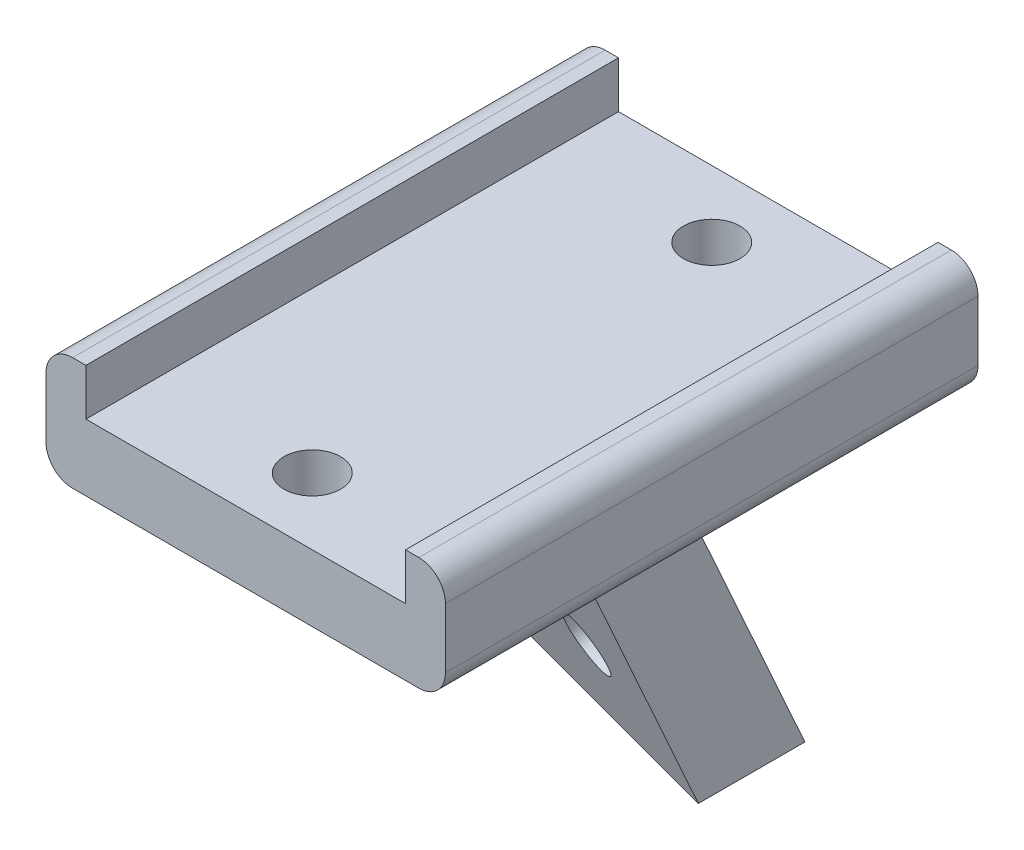
ISO-10303-21;
HEADER;
FILE_DESCRIPTION(('STEP AP214'),'2;1');
FILE_NAME('part.step','',(''),(''),'','','');
FILE_SCHEMA(('AUTOMOTIVE_DESIGN { 1 0 10303 214 1 1 1 1 }'));
ENDSEC;
DATA;
#1=APPLICATION_CONTEXT('core data for automotive mechanical design processes');
#2=APPLICATION_PROTOCOL_DEFINITION('international standard','automotive_design',2000,#1);
#3=PRODUCT_CONTEXT('',#1,'mechanical');
#4=PRODUCT('Part','Part','',(#3));
#5=PRODUCT_RELATED_PRODUCT_CATEGORY('part','',(#4));
#6=PRODUCT_DEFINITION_FORMATION('','',#4);
#7=PRODUCT_DEFINITION_CONTEXT('part definition',#1,'design');
#8=PRODUCT_DEFINITION('design','',#6,#7);
#9=PRODUCT_DEFINITION_SHAPE('','',#8);
#10=(LENGTH_UNIT() NAMED_UNIT(*) SI_UNIT(.MILLI.,.METRE.));
#11=(NAMED_UNIT(*) PLANE_ANGLE_UNIT() SI_UNIT($,.RADIAN.));
#12=(NAMED_UNIT(*) SI_UNIT($,.STERADIAN.) SOLID_ANGLE_UNIT());
#13=UNCERTAINTY_MEASURE_WITH_UNIT(LENGTH_MEASURE(1.E-05),#10,'distance_accuracy_value','');
#14=(GEOMETRIC_REPRESENTATION_CONTEXT(3) GLOBAL_UNCERTAINTY_ASSIGNED_CONTEXT((#13)) GLOBAL_UNIT_ASSIGNED_CONTEXT((#10,
#11,#12)) REPRESENTATION_CONTEXT('',''));
#15=CARTESIAN_POINT('',(0.,0.,0.));
#16=DIRECTION('',(0.,0.,1.));
#17=DIRECTION('',(1.,0.,0.));
#18=AXIS2_PLACEMENT_3D('',#15,#16,#17);
#19=CARTESIAN_POINT('',(0.,0.,0.));
#20=DIRECTION('',(0.,-1.,0.));
#21=DIRECTION('',(0.,0.,-1.));
#22=AXIS2_PLACEMENT_3D('',#19,#20,#21);
#23=PLANE('',#22);
#24=CARTESIAN_POINT('',(0.,0.,-15.));
#25=DIRECTION('',(0.,1.,0.));
#26=DIRECTION('',(0.,0.,1.));
#27=AXIS2_PLACEMENT_3D('',#24,#25,#26);
#28=CIRCLE('',#27,2.125);
#29=CARTESIAN_POINT('',(0.,0.,-12.875));
#30=VERTEX_POINT('',#29);
#31=EDGE_CURVE('E434',#30,#30,#28,.T.);
#32=ORIENTED_EDGE('',*,*,#31,.T.);
#33=EDGE_LOOP('',(#32));
#34=FACE_BOUND('',#33,.T.);
#35=DIRECTION('',(-1.,0.,0.));
#36=VECTOR('',#35,1.);
#37=CARTESIAN_POINT('',(-11.,0.,-20.));
#38=LINE('',#37,#36);
#39=CARTESIAN_POINT('',(13.,0.,-20.));
#40=VERTEX_POINT('',#39);
#41=CARTESIAN_POINT('',(-13.,0.,-20.));
#42=VERTEX_POINT('',#41);
#43=EDGE_CURVE('E440',#40,#42,#38,.T.);
#44=ORIENTED_EDGE('',*,*,#43,.F.);
#45=DIRECTION('',(0.,0.,-1.));
#46=VECTOR('',#45,1.);
#47=CARTESIAN_POINT('',(13.,0.,0.));
#48=LINE('',#47,#46);
#49=CARTESIAN_POINT('',(13.,0.,20.));
#50=VERTEX_POINT('',#49);
#51=EDGE_CURVE('E373',#40,#50,#48,.F.);
#52=ORIENTED_EDGE('',*,*,#51,.T.);
#53=DIRECTION('',(1.,0.,0.));
#54=VECTOR('',#53,1.);
#55=CARTESIAN_POINT('',(-11.,0.,20.));
#56=LINE('',#55,#54);
#57=CARTESIAN_POINT('',(-13.,0.,20.));
#58=VERTEX_POINT('',#57);
#59=EDGE_CURVE('E445',#58,#50,#56,.T.);
#60=ORIENTED_EDGE('',*,*,#59,.F.);
#61=DIRECTION('',(0.,0.,-1.));
#62=VECTOR('',#61,1.);
#63=CARTESIAN_POINT('',(-13.,0.,0.));
#64=LINE('',#63,#62);
#65=EDGE_CURVE('E463',#58,#42,#64,.T.);
#66=ORIENTED_EDGE('',*,*,#65,.T.);
#67=EDGE_LOOP('',(#44,#52,#60,#66));
#68=FACE_BOUND('',#67,.T.);
#69=CARTESIAN_POINT('',(0.,0.,15.));
#70=DIRECTION('',(0.,1.,0.));
#71=DIRECTION('',(0.,0.,1.));
#72=AXIS2_PLACEMENT_3D('',#69,#70,#71);
#73=CIRCLE('',#72,2.125);
#74=CARTESIAN_POINT('',(0.,0.,17.125));
#75=VERTEX_POINT('',#74);
#76=EDGE_CURVE('E418',#75,#75,#73,.T.);
#77=ORIENTED_EDGE('',*,*,#76,.T.);
#78=EDGE_LOOP('',(#77));
#79=FACE_BOUND('',#78,.T.);
#80=DIRECTION('',(0.965925826289067,0.,0.258819045102525));
#81=VECTOR('',#80,1.);
#82=CARTESIAN_POINT('',(11.,0.,-2.));
#83=LINE('',#82,#81);
#84=CARTESIAN_POINT('',(-11.,0.,-7.89488223348481));
#85=VERTEX_POINT('',#84);
#86=CARTESIAN_POINT('',(11.,0.,-2.));
#87=VERTEX_POINT('',#86);
#88=EDGE_CURVE('E179',#85,#87,#83,.T.);
#89=ORIENTED_EDGE('',*,*,#88,.F.);
#90=DIRECTION('',(0.,0.,-1.));
#91=VECTOR('',#90,1.);
#92=CARTESIAN_POINT('',(-11.,0.,-7.89488223348481));
#93=LINE('',#92,#91);
#94=CARTESIAN_POINT('',(-11.,0.,0.105117766515197));
#95=VERTEX_POINT('',#94);
#96=EDGE_CURVE('E186',#95,#85,#93,.T.);
#97=ORIENTED_EDGE('',*,*,#96,.F.);
#98=DIRECTION('',(-0.965925826289067,0.,-0.258819045102525));
#99=VECTOR('',#98,1.);
#100=CARTESIAN_POINT('',(-11.,0.,0.105117766515197));
#101=LINE('',#100,#99);
#102=CARTESIAN_POINT('',(11.,0.,6.));
#103=VERTEX_POINT('',#102);
#104=EDGE_CURVE('E184',#103,#95,#101,.T.);
#105=ORIENTED_EDGE('',*,*,#104,.F.);
#106=DIRECTION('',(0.,0.,1.));
#107=VECTOR('',#106,1.);
#108=CARTESIAN_POINT('',(11.,0.,6.));
#109=LINE('',#108,#107);
#110=EDGE_CURVE('E171',#87,#103,#109,.T.);
#111=ORIENTED_EDGE('',*,*,#110,.F.);
#112=EDGE_LOOP('',(#89,#97,#105,#111));
#113=FACE_BOUND('',#112,.T.);
#114=ADVANCED_FACE('F48',(#34,#68,#79,#113),#23,.T.);
#115=CARTESIAN_POINT('',(0.,5.,0.));
#116=DIRECTION('',(0.,-1.,0.));
#117=DIRECTION('',(0.,0.,-1.));
#118=AXIS2_PLACEMENT_3D('',#115,#116,#117);
#119=PLANE('',#118);
#120=DIRECTION('',(1.,0.,0.));
#121=VECTOR('',#120,1.);
#122=CARTESIAN_POINT('',(-11.,5.,20.));
#123=LINE('',#122,#121);
#124=CARTESIAN_POINT('',(-12.,5.,20.));
#125=VERTEX_POINT('',#124);
#126=CARTESIAN_POINT('',(12.,5.,20.));
#127=VERTEX_POINT('',#126);
#128=EDGE_CURVE('E444',#125,#127,#123,.T.);
#129=ORIENTED_EDGE('',*,*,#128,.T.);
#130=DIRECTION('',(0.,0.,-1.));
#131=VECTOR('',#130,1.);
#132=CARTESIAN_POINT('',(12.,5.,29.394147114028));
#133=LINE('',#132,#131);
#134=CARTESIAN_POINT('',(12.,5.,-20.));
#135=VERTEX_POINT('',#134);
#136=EDGE_CURVE('E427',#127,#135,#133,.T.);
#137=ORIENTED_EDGE('',*,*,#136,.T.);
#138=DIRECTION('',(-1.,0.,0.));
#139=VECTOR('',#138,1.);
#140=CARTESIAN_POINT('',(-11.,5.,-20.));
#141=LINE('',#140,#139);
#142=CARTESIAN_POINT('',(-12.,5.,-20.));
#143=VERTEX_POINT('',#142);
#144=EDGE_CURVE('E442',#135,#143,#141,.T.);
#145=ORIENTED_EDGE('',*,*,#144,.T.);
#146=DIRECTION('',(0.,0.,-1.));
#147=VECTOR('',#146,1.);
#148=CARTESIAN_POINT('',(-12.,5.,29.394147114028));
#149=LINE('',#148,#147);
#150=EDGE_CURVE('E390',#125,#143,#149,.T.);
#151=ORIENTED_EDGE('',*,*,#150,.F.);
#152=EDGE_LOOP('',(#129,#137,#145,#151));
#153=FACE_BOUND('',#152,.T.);
#154=CARTESIAN_POINT('',(0.,5.,-15.));
#155=DIRECTION('',(0.,1.,0.));
#156=DIRECTION('',(0.,0.,1.));
#157=AXIS2_PLACEMENT_3D('',#154,#155,#156);
#158=CIRCLE('',#157,2.125);
#159=CARTESIAN_POINT('',(0.,5.,-12.875));
#160=VERTEX_POINT('',#159);
#161=EDGE_CURVE('E437',#160,#160,#158,.T.);
#162=ORIENTED_EDGE('',*,*,#161,.F.);
#163=EDGE_LOOP('',(#162));
#164=FACE_BOUND('',#163,.T.);
#165=CARTESIAN_POINT('',(0.,5.,15.));
#166=DIRECTION('',(0.,1.,0.));
#167=DIRECTION('',(0.,0.,1.));
#168=AXIS2_PLACEMENT_3D('',#165,#166,#167);
#169=CIRCLE('',#168,2.125);
#170=CARTESIAN_POINT('',(0.,5.,17.125));
#171=VERTEX_POINT('',#170);
#172=EDGE_CURVE('E431',#171,#171,#169,.T.);
#173=ORIENTED_EDGE('',*,*,#172,.F.);
#174=EDGE_LOOP('',(#173));
#175=FACE_BOUND('',#174,.T.);
#176=ADVANCED_FACE('F325',(#153,#164,#175),#119,.F.);
#177=CARTESIAN_POINT('',(-11.,5.,-20.));
#178=DIRECTION('',(0.,0.,1.));
#179=DIRECTION('',(1.,0.,0.));
#180=AXIS2_PLACEMENT_3D('',#177,#178,#179);
#181=PLANE('',#180);
#182=DIRECTION('',(0.,-1.,0.));
#183=VECTOR('',#182,1.);
#184=CARTESIAN_POINT('',(15.,8.5,-20.));
#185=LINE('',#184,#183);
#186=CARTESIAN_POINT('',(15.,6.5,-20.));
#187=VERTEX_POINT('',#186);
#188=CARTESIAN_POINT('',(15.,2.,-20.));
#189=VERTEX_POINT('',#188);
#190=EDGE_CURVE('E424',#187,#189,#185,.T.);
#191=ORIENTED_EDGE('',*,*,#190,.T.);
#192=CARTESIAN_POINT('',(13.,2.,-20.));
#193=DIRECTION('',(0.,0.,1.));
#194=DIRECTION('',(1.,0.,0.));
#195=AXIS2_PLACEMENT_3D('',#192,#193,#194);
#196=CIRCLE('',#195,2.);
#197=EDGE_CURVE('E461',#189,#40,#196,.F.);
#198=ORIENTED_EDGE('',*,*,#197,.T.);
#199=ORIENTED_EDGE('',*,*,#43,.T.);
#200=CARTESIAN_POINT('',(-13.,2.,-20.));
#201=DIRECTION('',(0.,0.,1.));
#202=DIRECTION('',(1.,0.,0.));
#203=AXIS2_PLACEMENT_3D('',#200,#201,#202);
#204=CIRCLE('',#203,2.);
#205=CARTESIAN_POINT('',(-15.,2.,-20.));
#206=VERTEX_POINT('',#205);
#207=EDGE_CURVE('E459',#42,#206,#204,.F.);
#208=ORIENTED_EDGE('',*,*,#207,.T.);
#209=DIRECTION('',(0.,1.,0.));
#210=VECTOR('',#209,1.);
#211=CARTESIAN_POINT('',(-15.,8.5,-20.));
#212=LINE('',#211,#210);
#213=CARTESIAN_POINT('',(-15.,6.5,-20.));
#214=VERTEX_POINT('',#213);
#215=EDGE_CURVE('E286',#206,#214,#212,.T.);
#216=ORIENTED_EDGE('',*,*,#215,.T.);
#217=CARTESIAN_POINT('',(-13.,6.5,-20.));
#218=DIRECTION('',(0.,0.,1.));
#219=DIRECTION('',(1.,0.,0.));
#220=AXIS2_PLACEMENT_3D('',#217,#218,#219);
#221=CIRCLE('',#220,2.);
#222=CARTESIAN_POINT('',(-13.,8.5,-20.));
#223=VERTEX_POINT('',#222);
#224=EDGE_CURVE('E457',#214,#223,#221,.F.);
#225=ORIENTED_EDGE('',*,*,#224,.T.);
#226=DIRECTION('',(1.,0.,0.));
#227=VECTOR('',#226,1.);
#228=CARTESIAN_POINT('',(-12.,8.5,-20.));
#229=LINE('',#228,#227);
#230=CARTESIAN_POINT('',(-12.,8.5,-20.));
#231=VERTEX_POINT('',#230);
#232=EDGE_CURVE('E386',#223,#231,#229,.T.);
#233=ORIENTED_EDGE('',*,*,#232,.T.);
#234=DIRECTION('',(0.,-1.,0.));
#235=VECTOR('',#234,1.);
#236=CARTESIAN_POINT('',(-12.,5.,-20.));
#237=LINE('',#236,#235);
#238=EDGE_CURVE('E403',#231,#143,#237,.T.);
#239=ORIENTED_EDGE('',*,*,#238,.T.);
#240=ORIENTED_EDGE('',*,*,#144,.F.);
#241=DIRECTION('',(0.,1.,0.));
#242=VECTOR('',#241,1.);
#243=CARTESIAN_POINT('',(12.,5.,-20.));
#244=LINE('',#243,#242);
#245=CARTESIAN_POINT('',(12.,8.5,-20.));
#246=VERTEX_POINT('',#245);
#247=EDGE_CURVE('E408',#135,#246,#244,.T.);
#248=ORIENTED_EDGE('',*,*,#247,.T.);
#249=DIRECTION('',(1.,0.,0.));
#250=VECTOR('',#249,1.);
#251=CARTESIAN_POINT('',(12.,8.5,-20.));
#252=LINE('',#251,#250);
#253=CARTESIAN_POINT('',(13.,8.5,-20.));
#254=VERTEX_POINT('',#253);
#255=EDGE_CURVE('E421',#246,#254,#252,.T.);
#256=ORIENTED_EDGE('',*,*,#255,.T.);
#257=CARTESIAN_POINT('',(13.,6.5,-20.));
#258=DIRECTION('',(0.,0.,1.));
#259=DIRECTION('',(1.,0.,0.));
#260=AXIS2_PLACEMENT_3D('',#257,#258,#259);
#261=CIRCLE('',#260,2.);
#262=EDGE_CURVE('E455',#254,#187,#261,.F.);
#263=ORIENTED_EDGE('',*,*,#262,.T.);
#264=EDGE_LOOP('',(#191,#198,#199,#208,#216,#225,#233,#239,#240,#248,#256,#263));
#265=FACE_BOUND('',#264,.T.);
#266=ADVANCED_FACE('F331',(#265),#181,.F.);
#267=CARTESIAN_POINT('',(-11.,5.,20.));
#268=DIRECTION('',(0.,0.,-1.));
#269=DIRECTION('',(-1.,0.,0.));
#270=AXIS2_PLACEMENT_3D('',#267,#268,#269);
#271=PLANE('',#270);
#272=ORIENTED_EDGE('',*,*,#59,.T.);
#273=CARTESIAN_POINT('',(13.,2.,20.));
#274=DIRECTION('',(0.,0.,-1.));
#275=DIRECTION('',(-1.,0.,0.));
#276=AXIS2_PLACEMENT_3D('',#273,#274,#275);
#277=CIRCLE('',#276,2.);
#278=CARTESIAN_POINT('',(15.,2.,20.));
#279=VERTEX_POINT('',#278);
#280=EDGE_CURVE('E371',#50,#279,#277,.F.);
#281=ORIENTED_EDGE('',*,*,#280,.T.);
#282=DIRECTION('',(0.,1.,0.));
#283=VECTOR('',#282,1.);
#284=CARTESIAN_POINT('',(15.,8.5,20.));
#285=LINE('',#284,#283);
#286=CARTESIAN_POINT('',(15.,6.5,20.));
#287=VERTEX_POINT('',#286);
#288=EDGE_CURVE('E415',#279,#287,#285,.T.);
#289=ORIENTED_EDGE('',*,*,#288,.T.);
#290=CARTESIAN_POINT('',(13.,6.5,20.));
#291=DIRECTION('',(0.,0.,-1.));
#292=DIRECTION('',(-1.,0.,0.));
#293=AXIS2_PLACEMENT_3D('',#290,#291,#292);
#294=CIRCLE('',#293,2.);
#295=CARTESIAN_POINT('',(13.,8.5,20.));
#296=VERTEX_POINT('',#295);
#297=EDGE_CURVE('E369',#287,#296,#294,.F.);
#298=ORIENTED_EDGE('',*,*,#297,.T.);
#299=DIRECTION('',(-1.,0.,0.));
#300=VECTOR('',#299,1.);
#301=CARTESIAN_POINT('',(12.,8.5,20.));
#302=LINE('',#301,#300);
#303=CARTESIAN_POINT('',(12.,8.5,20.));
#304=VERTEX_POINT('',#303);
#305=EDGE_CURVE('E412',#296,#304,#302,.T.);
#306=ORIENTED_EDGE('',*,*,#305,.T.);
#307=DIRECTION('',(0.,-1.,0.));
#308=VECTOR('',#307,1.);
#309=CARTESIAN_POINT('',(12.,5.,20.));
#310=LINE('',#309,#308);
#311=EDGE_CURVE('E409',#304,#127,#310,.T.);
#312=ORIENTED_EDGE('',*,*,#311,.T.);
#313=ORIENTED_EDGE('',*,*,#128,.F.);
#314=DIRECTION('',(0.,1.,0.));
#315=VECTOR('',#314,1.);
#316=CARTESIAN_POINT('',(-12.,5.,20.));
#317=LINE('',#316,#315);
#318=CARTESIAN_POINT('',(-12.,8.5,20.));
#319=VERTEX_POINT('',#318);
#320=EDGE_CURVE('E389',#125,#319,#317,.T.);
#321=ORIENTED_EDGE('',*,*,#320,.T.);
#322=DIRECTION('',(-1.,0.,0.));
#323=VECTOR('',#322,1.);
#324=CARTESIAN_POINT('',(-12.,8.5,20.));
#325=LINE('',#324,#323);
#326=CARTESIAN_POINT('',(-13.,8.5,20.));
#327=VERTEX_POINT('',#326);
#328=EDGE_CURVE('E384',#319,#327,#325,.T.);
#329=ORIENTED_EDGE('',*,*,#328,.T.);
#330=CARTESIAN_POINT('',(-13.,6.5,20.));
#331=DIRECTION('',(0.,0.,-1.));
#332=DIRECTION('',(-1.,0.,0.));
#333=AXIS2_PLACEMENT_3D('',#330,#331,#332);
#334=CIRCLE('',#333,2.);
#335=CARTESIAN_POINT('',(-15.,6.5,20.));
#336=VERTEX_POINT('',#335);
#337=EDGE_CURVE('E364',#327,#336,#334,.F.);
#338=ORIENTED_EDGE('',*,*,#337,.T.);
#339=DIRECTION('',(0.,-1.,0.));
#340=VECTOR('',#339,1.);
#341=CARTESIAN_POINT('',(-15.,8.5,20.));
#342=LINE('',#341,#340);
#343=CARTESIAN_POINT('',(-15.,2.,20.));
#344=VERTEX_POINT('',#343);
#345=EDGE_CURVE('E392',#336,#344,#342,.T.);
#346=ORIENTED_EDGE('',*,*,#345,.T.);
#347=CARTESIAN_POINT('',(-13.,2.,20.));
#348=DIRECTION('',(0.,0.,-1.));
#349=DIRECTION('',(-1.,0.,0.));
#350=AXIS2_PLACEMENT_3D('',#347,#348,#349);
#351=CIRCLE('',#350,2.);
#352=EDGE_CURVE('E368',#344,#58,#351,.F.);
#353=ORIENTED_EDGE('',*,*,#352,.T.);
#354=EDGE_LOOP('',(#272,#281,#289,#298,#306,#312,#313,#321,#329,#338,#346,#353));
#355=FACE_BOUND('',#354,.T.);
#356=ADVANCED_FACE('F338',(#355),#271,.F.);
#357=CARTESIAN_POINT('',(0.,5.,-15.));
#358=DIRECTION('',(0.,-1.,0.));
#359=DIRECTION('',(0.,0.,-1.));
#360=AXIS2_PLACEMENT_3D('',#357,#358,#359);
#361=CYLINDRICAL_SURFACE('',#360,2.125);
#362=ORIENTED_EDGE('',*,*,#161,.T.);
#363=EDGE_LOOP('',(#362));
#364=FACE_BOUND('',#363,.T.);
#365=ORIENTED_EDGE('',*,*,#31,.F.);
#366=EDGE_LOOP('',(#365));
#367=FACE_BOUND('',#366,.T.);
#368=ADVANCED_FACE('F341',(#364,#367),#361,.F.);
#369=CARTESIAN_POINT('',(0.,5.,15.));
#370=DIRECTION('',(0.,-1.,0.));
#371=DIRECTION('',(0.,0.,-1.));
#372=AXIS2_PLACEMENT_3D('',#369,#370,#371);
#373=CYLINDRICAL_SURFACE('',#372,2.125);
#374=ORIENTED_EDGE('',*,*,#172,.T.);
#375=EDGE_LOOP('',(#374));
#376=FACE_BOUND('',#375,.T.);
#377=ORIENTED_EDGE('',*,*,#76,.F.);
#378=EDGE_LOOP('',(#377));
#379=FACE_BOUND('',#378,.T.);
#380=ADVANCED_FACE('F502',(#376,#379),#373,.F.);
#381=CARTESIAN_POINT('',(15.,8.5,29.394147114028));
#382=DIRECTION('',(1.,0.,0.));
#383=DIRECTION('',(0.,1.,0.));
#384=AXIS2_PLACEMENT_3D('',#381,#382,#383);
#385=PLANE('',#384);
#386=ORIENTED_EDGE('',*,*,#288,.F.);
#387=DIRECTION('',(0.,0.,-1.));
#388=VECTOR('',#387,1.);
#389=CARTESIAN_POINT('',(15.,2.,29.394147114028));
#390=LINE('',#389,#388);
#391=EDGE_CURVE('E452',#279,#189,#390,.T.);
#392=ORIENTED_EDGE('',*,*,#391,.T.);
#393=ORIENTED_EDGE('',*,*,#190,.F.);
#394=DIRECTION('',(0.,0.,-1.));
#395=VECTOR('',#394,1.);
#396=CARTESIAN_POINT('',(15.,6.5,29.394147114028));
#397=LINE('',#396,#395);
#398=EDGE_CURVE('E447',#187,#287,#397,.F.);
#399=ORIENTED_EDGE('',*,*,#398,.T.);
#400=EDGE_LOOP('',(#386,#392,#393,#399));
#401=FACE_BOUND('',#400,.T.);
#402=ADVANCED_FACE('F476',(#401),#385,.T.);
#403=CARTESIAN_POINT('',(12.,8.5,29.394147114028));
#404=DIRECTION('',(0.,1.,0.));
#405=DIRECTION('',(0.,0.,1.));
#406=AXIS2_PLACEMENT_3D('',#403,#404,#405);
#407=PLANE('',#406);
#408=ORIENTED_EDGE('',*,*,#305,.F.);
#409=DIRECTION('',(0.,0.,-1.));
#410=VECTOR('',#409,1.);
#411=CARTESIAN_POINT('',(13.,8.5,29.394147114028));
#412=LINE('',#411,#410);
#413=EDGE_CURVE('E12',#296,#254,#412,.T.);
#414=ORIENTED_EDGE('',*,*,#413,.T.);
#415=ORIENTED_EDGE('',*,*,#255,.F.);
#416=DIRECTION('',(0.,0.,-1.));
#417=VECTOR('',#416,1.);
#418=CARTESIAN_POINT('',(12.,8.5,29.394147114028));
#419=LINE('',#418,#417);
#420=EDGE_CURVE('E413',#304,#246,#419,.T.);
#421=ORIENTED_EDGE('',*,*,#420,.F.);
#422=EDGE_LOOP('',(#408,#414,#415,#421));
#423=FACE_BOUND('',#422,.T.);
#424=ADVANCED_FACE('F483',(#423),#407,.T.);
#425=CARTESIAN_POINT('',(12.,5.,29.394147114028));
#426=DIRECTION('',(-1.,0.,0.));
#427=DIRECTION('',(0.,0.,1.));
#428=AXIS2_PLACEMENT_3D('',#425,#426,#427);
#429=PLANE('',#428);
#430=ORIENTED_EDGE('',*,*,#311,.F.);
#431=ORIENTED_EDGE('',*,*,#420,.T.);
#432=ORIENTED_EDGE('',*,*,#247,.F.);
#433=ORIENTED_EDGE('',*,*,#136,.F.);
#434=EDGE_LOOP('',(#430,#431,#432,#433));
#435=FACE_BOUND('',#434,.T.);
#436=ADVANCED_FACE('F488',(#435),#429,.T.);
#437=CARTESIAN_POINT('',(-12.,5.,29.394147114028));
#438=DIRECTION('',(1.,0.,0.));
#439=DIRECTION('',(0.,0.,-1.));
#440=AXIS2_PLACEMENT_3D('',#437,#438,#439);
#441=PLANE('',#440);
#442=ORIENTED_EDGE('',*,*,#320,.F.);
#443=ORIENTED_EDGE('',*,*,#150,.T.);
#444=ORIENTED_EDGE('',*,*,#238,.F.);
#445=DIRECTION('',(0.,0.,-1.));
#446=VECTOR('',#445,1.);
#447=CARTESIAN_POINT('',(-12.,8.5,29.394147114028));
#448=LINE('',#447,#446);
#449=EDGE_CURVE('E395',#319,#231,#448,.T.);
#450=ORIENTED_EDGE('',*,*,#449,.F.);
#451=EDGE_LOOP('',(#442,#443,#444,#450));
#452=FACE_BOUND('',#451,.T.);
#453=ADVANCED_FACE('F253',(#452),#441,.T.);
#454=CARTESIAN_POINT('',(-12.,8.5,29.394147114028));
#455=DIRECTION('',(0.,1.,0.));
#456=DIRECTION('',(0.,0.,1.));
#457=AXIS2_PLACEMENT_3D('',#454,#455,#456);
#458=PLANE('',#457);
#459=ORIENTED_EDGE('',*,*,#232,.F.);
#460=DIRECTION('',(0.,0.,-1.));
#461=VECTOR('',#460,1.);
#462=CARTESIAN_POINT('',(-13.,8.5,29.394147114028));
#463=LINE('',#462,#461);
#464=EDGE_CURVE('E57',#223,#327,#463,.F.);
#465=ORIENTED_EDGE('',*,*,#464,.T.);
#466=ORIENTED_EDGE('',*,*,#328,.F.);
#467=ORIENTED_EDGE('',*,*,#449,.T.);
#468=EDGE_LOOP('',(#459,#465,#466,#467));
#469=FACE_BOUND('',#468,.T.);
#470=ADVANCED_FACE('F382',(#469),#458,.T.);
#471=CARTESIAN_POINT('',(-15.,8.5,29.394147114028));
#472=DIRECTION('',(-1.,0.,0.));
#473=DIRECTION('',(0.,-1.,0.));
#474=AXIS2_PLACEMENT_3D('',#471,#472,#473);
#475=PLANE('',#474);
#476=ORIENTED_EDGE('',*,*,#215,.F.);
#477=DIRECTION('',(0.,0.,-1.));
#478=VECTOR('',#477,1.);
#479=CARTESIAN_POINT('',(-15.,2.,29.394147114028));
#480=LINE('',#479,#478);
#481=EDGE_CURVE('E73',#206,#344,#480,.F.);
#482=ORIENTED_EDGE('',*,*,#481,.T.);
#483=ORIENTED_EDGE('',*,*,#345,.F.);
#484=DIRECTION('',(0.,0.,-1.));
#485=VECTOR('',#484,1.);
#486=CARTESIAN_POINT('',(-15.,6.5,29.394147114028));
#487=LINE('',#486,#485);
#488=EDGE_CURVE('E366',#336,#214,#487,.T.);
#489=ORIENTED_EDGE('',*,*,#488,.T.);
#490=EDGE_LOOP('',(#476,#482,#483,#489));
#491=FACE_BOUND('',#490,.T.);
#492=ADVANCED_FACE('F350',(#491),#475,.T.);
#493=CARTESIAN_POINT('',(13.,2.,29.394147114028));
#494=DIRECTION('',(0.,0.,-1.));
#495=DIRECTION('',(-1.,0.,0.));
#496=AXIS2_PLACEMENT_3D('',#493,#494,#495);
#497=CYLINDRICAL_SURFACE('',#496,2.);
#498=ORIENTED_EDGE('',*,*,#280,.F.);
#499=ORIENTED_EDGE('',*,*,#51,.F.);
#500=ORIENTED_EDGE('',*,*,#197,.F.);
#501=ORIENTED_EDGE('',*,*,#391,.F.);
#502=EDGE_LOOP('',(#498,#499,#500,#501));
#503=FACE_BOUND('',#502,.T.);
#504=ADVANCED_FACE('F346',(#503),#497,.T.);
#505=CARTESIAN_POINT('',(-13.,2.,0.));
#506=DIRECTION('',(0.,0.,-1.));
#507=DIRECTION('',(-1.,0.,0.));
#508=AXIS2_PLACEMENT_3D('',#505,#506,#507);
#509=CYLINDRICAL_SURFACE('',#508,2.);
#510=ORIENTED_EDGE('',*,*,#352,.F.);
#511=ORIENTED_EDGE('',*,*,#481,.F.);
#512=ORIENTED_EDGE('',*,*,#207,.F.);
#513=ORIENTED_EDGE('',*,*,#65,.F.);
#514=EDGE_LOOP('',(#510,#511,#512,#513));
#515=FACE_BOUND('',#514,.T.);
#516=ADVANCED_FACE('F349',(#515),#509,.T.);
#517=CARTESIAN_POINT('',(-13.,6.5,29.394147114028));
#518=DIRECTION('',(0.,0.,-1.));
#519=DIRECTION('',(-1.,0.,0.));
#520=AXIS2_PLACEMENT_3D('',#517,#518,#519);
#521=CYLINDRICAL_SURFACE('',#520,2.);
#522=ORIENTED_EDGE('',*,*,#337,.F.);
#523=ORIENTED_EDGE('',*,*,#464,.F.);
#524=ORIENTED_EDGE('',*,*,#224,.F.);
#525=ORIENTED_EDGE('',*,*,#488,.F.);
#526=EDGE_LOOP('',(#522,#523,#524,#525));
#527=FACE_BOUND('',#526,.T.);
#528=ADVANCED_FACE('F353',(#527),#521,.T.);
#529=CARTESIAN_POINT('',(13.,6.5,29.394147114028));
#530=DIRECTION('',(0.,0.,-1.));
#531=DIRECTION('',(-1.,0.,0.));
#532=AXIS2_PLACEMENT_3D('',#529,#530,#531);
#533=CYLINDRICAL_SURFACE('',#532,2.);
#534=ORIENTED_EDGE('',*,*,#297,.F.);
#535=ORIENTED_EDGE('',*,*,#398,.F.);
#536=ORIENTED_EDGE('',*,*,#262,.F.);
#537=ORIENTED_EDGE('',*,*,#413,.F.);
#538=EDGE_LOOP('',(#534,#535,#536,#537));
#539=FACE_BOUND('',#538,.T.);
#540=ADVANCED_FACE('F50',(#539),#533,.T.);
#541=CARTESIAN_POINT('',(0.,-20.,0.));
#542=DIRECTION('',(0.,1.,0.));
#543=DIRECTION('',(0.,0.,1.));
#544=AXIS2_PLACEMENT_3D('',#541,#542,#543);
#545=PLANE('',#544);
#546=DIRECTION('',(-0.965925826289069,0.,-0.258819045102518));
#547=VECTOR('',#546,1.);
#548=CARTESIAN_POINT('',(-11.,-20.,-8.89488223348463));
#549=LINE('',#548,#547);
#550=CARTESIAN_POINT('',(11.,-20.,-3.));
#551=VERTEX_POINT('',#550);
#552=CARTESIAN_POINT('',(-11.,-20.,-8.89488223348463));
#553=VERTEX_POINT('',#552);
#554=EDGE_CURVE('E214',#551,#553,#549,.T.);
#555=ORIENTED_EDGE('',*,*,#554,.T.);
#556=DIRECTION('',(0.,0.,-1.));
#557=VECTOR('',#556,1.);
#558=CARTESIAN_POINT('',(-11.,-20.,-16.8948822334846));
#559=LINE('',#558,#557);
#560=CARTESIAN_POINT('',(-11.,-20.,-16.8948822334846));
#561=VERTEX_POINT('',#560);
#562=EDGE_CURVE('E227',#553,#561,#559,.T.);
#563=ORIENTED_EDGE('',*,*,#562,.T.);
#564=DIRECTION('',(0.965925826289069,0.,0.258819045102518));
#565=VECTOR('',#564,1.);
#566=CARTESIAN_POINT('',(11.,-20.,-11.));
#567=LINE('',#566,#565);
#568=CARTESIAN_POINT('',(11.,-20.,-11.));
#569=VERTEX_POINT('',#568);
#570=EDGE_CURVE('E281',#561,#569,#567,.T.);
#571=ORIENTED_EDGE('',*,*,#570,.T.);
#572=DIRECTION('',(0.,0.,1.));
#573=VECTOR('',#572,1.);
#574=CARTESIAN_POINT('',(11.,-20.,-3.));
#575=LINE('',#574,#573);
#576=EDGE_CURVE('E173',#569,#551,#575,.T.);
#577=ORIENTED_EDGE('',*,*,#576,.T.);
#578=EDGE_LOOP('',(#555,#563,#571,#577));
#579=FACE_BOUND('',#578,.T.);
#580=ADVANCED_FACE('F248',(#579),#545,.F.);
#581=CARTESIAN_POINT('',(11.,0.,0.));
#582=DIRECTION('',(-1.,0.,0.));
#583=DIRECTION('',(0.,0.,1.));
#584=AXIS2_PLACEMENT_3D('',#581,#582,#583);
#585=PLANE('',#584);
#586=DIRECTION('',(0.,-0.911921505175106,-0.410364677328798));
#587=VECTOR('',#586,1.);
#588=CARTESIAN_POINT('',(11.,0.,6.));
#589=LINE('',#588,#587);
#590=EDGE_CURVE('E176',#103,#551,#589,.T.);
#591=ORIENTED_EDGE('',*,*,#590,.T.);
#592=ORIENTED_EDGE('',*,*,#576,.F.);
#593=DIRECTION('',(0.,-0.911921505175106,-0.410364677328798));
#594=VECTOR('',#593,1.);
#595=CARTESIAN_POINT('',(11.,0.,-2.));
#596=LINE('',#595,#594);
#597=EDGE_CURVE('E167',#87,#569,#596,.T.);
#598=ORIENTED_EDGE('',*,*,#597,.F.);
#599=ORIENTED_EDGE('',*,*,#110,.T.);
#600=EDGE_LOOP('',(#591,#592,#598,#599));
#601=FACE_BOUND('',#600,.T.);
#602=ADVANCED_FACE('F169',(#601),#585,.F.);
#603=CARTESIAN_POINT('',(1.04030935597384,1.74711931743764,-3.88248737208365));
#604=DIRECTION('',(-0.237365262193968,-0.398636648306913,0.885859218459807));
#605=DIRECTION('',(0.,-0.911921505175107,-0.410364677328798));
#606=AXIS2_PLACEMENT_3D('',#603,#604,#605);
#607=PLANE('',#606);
#608=CARTESIAN_POINT('',(6.14289764287496,-9.17108948068132,-7.4284469204535));
#609=DIRECTION('',(-0.237365262193975,-0.398636648306906,0.885859218459808));
#610=DIRECTION('',(0.,-0.911921505175109,-0.410364677328791));
#611=AXIS2_PLACEMENT_3D('',#608,#609,#610);
#612=CIRCLE('',#611,2.125);
#613=CARTESIAN_POINT('',(6.14289764287496,-11.1089226791784,-8.30047185977718));
#614=VERTEX_POINT('',#613);
#615=EDGE_CURVE('E200',#614,#614,#612,.T.);
#616=ORIENTED_EDGE('',*,*,#615,.T.);
#617=EDGE_LOOP('',(#616));
#618=FACE_BOUND('',#617,.T.);
#619=CARTESIAN_POINT('',(-6.14289764287496,-9.17108948068132,-10.7204158456443));
#620=DIRECTION('',(-0.237365262193975,-0.398636648306906,0.885859218459808));
#621=DIRECTION('',(0.,-0.911921505175109,-0.410364677328791));
#622=AXIS2_PLACEMENT_3D('',#619,#620,#621);
#623=CIRCLE('',#622,2.125);
#624=CARTESIAN_POINT('',(-6.14289764287496,-11.1089226791784,-11.592440784968));
#625=VERTEX_POINT('',#624);
#626=EDGE_CURVE('E208',#625,#625,#623,.T.);
#627=ORIENTED_EDGE('',*,*,#626,.T.);
#628=EDGE_LOOP('',(#627));
#629=FACE_BOUND('',#628,.T.);
#630=ORIENTED_EDGE('',*,*,#597,.T.);
#631=ORIENTED_EDGE('',*,*,#570,.F.);
#632=DIRECTION('',(0.,-0.911921505175109,-0.410364677328791));
#633=VECTOR('',#632,1.);
#634=CARTESIAN_POINT('',(-11.,0.,-7.89488223348481));
#635=LINE('',#634,#633);
#636=EDGE_CURVE('E65',#85,#561,#635,.T.);
#637=ORIENTED_EDGE('',*,*,#636,.F.);
#638=ORIENTED_EDGE('',*,*,#88,.T.);
#639=EDGE_LOOP('',(#630,#631,#637,#638));
#640=FACE_BOUND('',#639,.T.);
#641=ADVANCED_FACE('F180',(#618,#629,#640),#607,.F.);
#642=CARTESIAN_POINT('',(-0.641868289279378,-1.07796828031107,2.39548506735798));
#643=DIRECTION('',(0.237365262193969,0.398636648306907,-0.885859218459809));
#644=DIRECTION('',(0.,0.911921505175109,0.410364677328792));
#645=AXIS2_PLACEMENT_3D('',#642,#643,#644);
#646=PLANE('',#645);
#647=CARTESIAN_POINT('',(4.46071999762168,-11.99617707843,-1.15047448101182));
#648=DIRECTION('',(0.237365262193969,0.398636648306907,-0.885859218459809));
#649=DIRECTION('',(0.,0.911921505175109,0.410364677328792));
#650=AXIS2_PLACEMENT_3D('',#647,#648,#649);
#651=CIRCLE('',#650,2.125);
#652=CARTESIAN_POINT('',(4.46071999762168,-10.0583438799329,-0.27844954168814));
#653=VERTEX_POINT('',#652);
#654=EDGE_CURVE('E193',#653,#653,#651,.T.);
#655=ORIENTED_EDGE('',*,*,#654,.T.);
#656=EDGE_LOOP('',(#655));
#657=FACE_BOUND('',#656,.T.);
#658=CARTESIAN_POINT('',(-7.82507528812826,-11.9961770784301,-4.44244340620259));
#659=DIRECTION('',(0.237365262193969,0.398636648306907,-0.885859218459809));
#660=DIRECTION('',(0.,0.911921505175109,0.410364677328792));
#661=AXIS2_PLACEMENT_3D('',#658,#659,#660);
#662=CIRCLE('',#661,2.125);
#663=CARTESIAN_POINT('',(-7.82507528812826,-10.058343879933,-3.57041846687891));
#664=VERTEX_POINT('',#663);
#665=EDGE_CURVE('E205',#664,#664,#662,.T.);
#666=ORIENTED_EDGE('',*,*,#665,.T.);
#667=EDGE_LOOP('',(#666));
#668=FACE_BOUND('',#667,.T.);
#669=DIRECTION('',(0.,-0.911921505175109,-0.410364677328791));
#670=VECTOR('',#669,1.);
#671=CARTESIAN_POINT('',(-11.,0.,0.105117766515197));
#672=LINE('',#671,#670);
#673=EDGE_CURVE('E175',#95,#553,#672,.T.);
#674=ORIENTED_EDGE('',*,*,#673,.T.);
#675=ORIENTED_EDGE('',*,*,#554,.F.);
#676=ORIENTED_EDGE('',*,*,#590,.F.);
#677=ORIENTED_EDGE('',*,*,#104,.T.);
#678=EDGE_LOOP('',(#674,#675,#676,#677));
#679=FACE_BOUND('',#678,.T.);
#680=ADVANCED_FACE('F245',(#657,#668,#679),#646,.F.);
#681=CARTESIAN_POINT('',(-11.,0.,0.));
#682=DIRECTION('',(1.,0.,0.));
#683=DIRECTION('',(0.,1.,0.));
#684=AXIS2_PLACEMENT_3D('',#681,#682,#683);
#685=PLANE('',#684);
#686=ORIENTED_EDGE('',*,*,#636,.T.);
#687=ORIENTED_EDGE('',*,*,#562,.F.);
#688=ORIENTED_EDGE('',*,*,#673,.F.);
#689=ORIENTED_EDGE('',*,*,#96,.T.);
#690=EDGE_LOOP('',(#686,#687,#688,#689));
#691=FACE_BOUND('',#690,.T.);
#692=ADVANCED_FACE('F234',(#691),#685,.F.);
#693=CARTESIAN_POINT('',(-9.25173727350986,-14.392145835032,0.881931608468544));
#694=DIRECTION('',(0.237365262193975,0.398636648306906,-0.885859218459808));
#695=DIRECTION('',(0.,0.911921505175109,0.410364677328791));
#696=AXIS2_PLACEMENT_3D('',#693,#694,#695);
#697=CYLINDRICAL_SURFACE('',#696,2.125);
#698=ORIENTED_EDGE('',*,*,#665,.F.);
#699=EDGE_LOOP('',(#698));
#700=FACE_BOUND('',#699,.T.);
#701=ORIENTED_EDGE('',*,*,#626,.F.);
#702=EDGE_LOOP('',(#701));
#703=FACE_BOUND('',#702,.T.);
#704=ADVANCED_FACE('F244',(#700,#703),#697,.F.);
#705=CARTESIAN_POINT('',(3.03405801224006,-14.392145835032,4.17390053365939));
#706=DIRECTION('',(0.237365262193975,0.398636648306906,-0.885859218459808));
#707=DIRECTION('',(0.,0.911921505175109,0.410364677328791));
#708=AXIS2_PLACEMENT_3D('',#705,#706,#707);
#709=CYLINDRICAL_SURFACE('',#708,2.125);
#710=ORIENTED_EDGE('',*,*,#654,.F.);
#711=EDGE_LOOP('',(#710));
#712=FACE_BOUND('',#711,.T.);
#713=ORIENTED_EDGE('',*,*,#615,.F.);
#714=EDGE_LOOP('',(#713));
#715=FACE_BOUND('',#714,.T.);
#716=ADVANCED_FACE('F618',(#712,#715),#709,.F.);
#717=CLOSED_SHELL('',(#114,#176,#266,#356,#368,#380,#402,#424,#436,#453,#470,#492,#504,#516,
#528,#540,#580,#602,#641,#680,#692,#704,#716));
#718=MANIFOLD_SOLID_BREP('B2',#717);
#719=ADVANCED_BREP_SHAPE_REPRESENTATION('',(#18,#718),#14);
#720=SHAPE_DEFINITION_REPRESENTATION(#9,#719);
ENDSEC;
END-ISO-10303-21;
